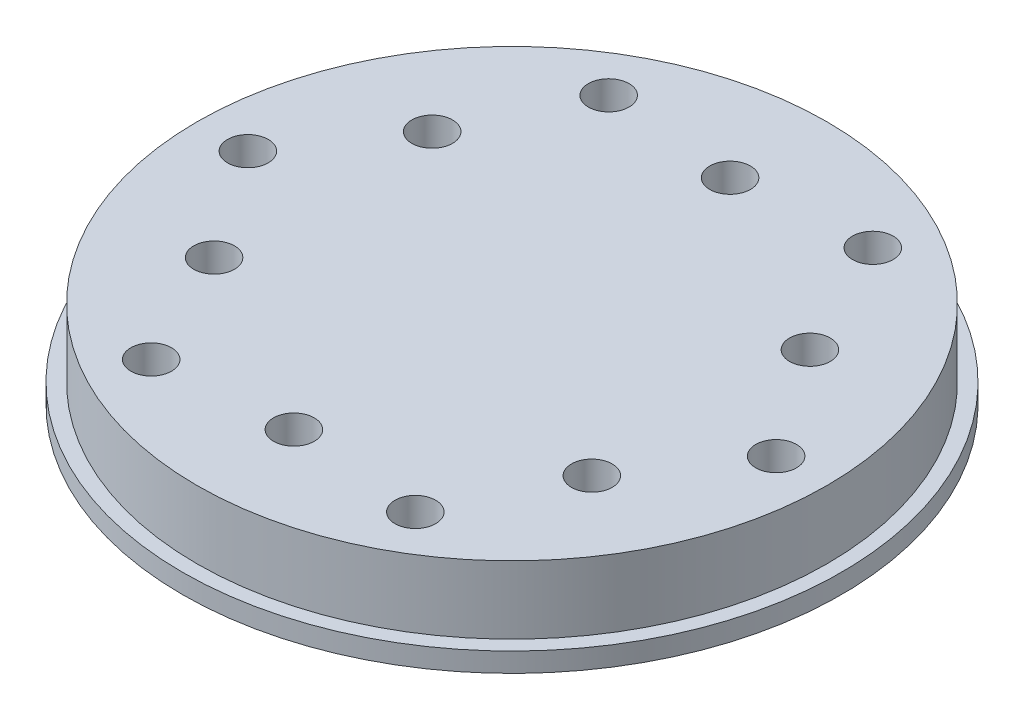
ISO-10303-21;
HEADER;
FILE_DESCRIPTION(('STEP AP214'),'2;1');
FILE_NAME('part.step','',(''),(''),'','','');
FILE_SCHEMA(('AUTOMOTIVE_DESIGN { 1 0 10303 214 1 1 1 1 }'));
ENDSEC;
DATA;
#1=APPLICATION_CONTEXT('core data for automotive mechanical design processes');
#2=APPLICATION_PROTOCOL_DEFINITION('international standard','automotive_design',2000,#1);
#3=PRODUCT_CONTEXT('',#1,'mechanical');
#4=PRODUCT('Part','Part','',(#3));
#5=PRODUCT_RELATED_PRODUCT_CATEGORY('part','',(#4));
#6=PRODUCT_DEFINITION_FORMATION('','',#4);
#7=PRODUCT_DEFINITION_CONTEXT('part definition',#1,'design');
#8=PRODUCT_DEFINITION('design','',#6,#7);
#9=PRODUCT_DEFINITION_SHAPE('','',#8);
#10=(LENGTH_UNIT() NAMED_UNIT(*) SI_UNIT(.MILLI.,.METRE.));
#11=(NAMED_UNIT(*) PLANE_ANGLE_UNIT() SI_UNIT($,.RADIAN.));
#12=(NAMED_UNIT(*) SI_UNIT($,.STERADIAN.) SOLID_ANGLE_UNIT());
#13=UNCERTAINTY_MEASURE_WITH_UNIT(LENGTH_MEASURE(1.E-05),#10,'distance_accuracy_value','');
#14=(GEOMETRIC_REPRESENTATION_CONTEXT(3) GLOBAL_UNCERTAINTY_ASSIGNED_CONTEXT((#13)) GLOBAL_UNIT_ASSIGNED_CONTEXT((#10,
#11,#12)) REPRESENTATION_CONTEXT('',''));
#15=CARTESIAN_POINT('',(0.,0.,0.));
#16=DIRECTION('',(0.,0.,1.));
#17=DIRECTION('',(1.,0.,0.));
#18=AXIS2_PLACEMENT_3D('',#15,#16,#17);
#19=CARTESIAN_POINT('',(0.,10.,0.));
#20=DIRECTION('',(0.,-1.,0.));
#21=DIRECTION('',(0.,0.,-1.));
#22=AXIS2_PLACEMENT_3D('',#19,#20,#21);
#23=CYLINDRICAL_SURFACE('',#22,32.5);
#24=CARTESIAN_POINT('',(0.,10.,0.));
#25=DIRECTION('',(0.,1.,0.));
#26=DIRECTION('',(0.,0.,1.));
#27=AXIS2_PLACEMENT_3D('',#24,#25,#26);
#28=CIRCLE('',#27,32.5);
#29=CARTESIAN_POINT('',(0.,10.,32.5));
#30=VERTEX_POINT('',#29);
#31=EDGE_CURVE('E64',#30,#30,#28,.T.);
#32=ORIENTED_EDGE('',*,*,#31,.F.);
#33=EDGE_LOOP('',(#32));
#34=FACE_BOUND('',#33,.T.);
#35=CARTESIAN_POINT('',(0.,2.99999999999996,0.));
#36=DIRECTION('',(0.,-1.,0.));
#37=DIRECTION('',(0.,0.,-1.));
#38=AXIS2_PLACEMENT_3D('',#35,#36,#37);
#39=CIRCLE('',#38,32.5);
#40=CARTESIAN_POINT('',(0.,2.99999999999991,-32.5));
#41=VERTEX_POINT('',#40);
#42=EDGE_CURVE('E12',#41,#41,#39,.T.);
#43=ORIENTED_EDGE('',*,*,#42,.F.);
#44=EDGE_LOOP('',(#43));
#45=FACE_BOUND('',#44,.T.);
#46=ADVANCED_FACE('F56',(#34,#45),#23,.T.);
#47=CARTESIAN_POINT('',(0.,0.,0.));
#48=DIRECTION('',(0.,1.,0.));
#49=DIRECTION('',(0.,0.,1.));
#50=AXIS2_PLACEMENT_3D('',#47,#48,#49);
#51=PLANE('',#50);
#52=CARTESIAN_POINT('',(0.,0.,0.));
#53=DIRECTION('',(0.,1.,0.));
#54=DIRECTION('',(0.,0.,1.));
#55=AXIS2_PLACEMENT_3D('',#52,#53,#54);
#56=CIRCLE('',#55,6.5);
#57=CARTESIAN_POINT('',(0.,0.,6.5));
#58=VERTEX_POINT('',#57);
#59=EDGE_CURVE('E72',#58,#58,#56,.T.);
#60=ORIENTED_EDGE('',*,*,#59,.T.);
#61=EDGE_LOOP('',(#60));
#62=FACE_BOUND('',#61,.T.);
#63=CARTESIAN_POINT('',(0.,0.,0.));
#64=DIRECTION('',(0.,-1.,0.));
#65=DIRECTION('',(0.,0.,-1.));
#66=AXIS2_PLACEMENT_3D('',#63,#64,#65);
#67=CIRCLE('',#66,17.5);
#68=CARTESIAN_POINT('',(0.,0.,-17.5));
#69=VERTEX_POINT('',#68);
#70=EDGE_CURVE('E130',#69,#69,#67,.T.);
#71=ORIENTED_EDGE('',*,*,#70,.T.);
#72=EDGE_LOOP('',(#71));
#73=FACE_BOUND('',#72,.T.);
#74=ADVANCED_FACE('F224',(#62,#73),#51,.F.);
#75=CARTESIAN_POINT('',(0.,10.,0.));
#76=DIRECTION('',(0.,-1.,0.));
#77=DIRECTION('',(0.,0.,-1.));
#78=AXIS2_PLACEMENT_3D('',#75,#76,#77);
#79=CYLINDRICAL_SURFACE('',#78,6.5);
#80=ORIENTED_EDGE('',*,*,#59,.F.);
#81=EDGE_LOOP('',(#80));
#82=FACE_BOUND('',#81,.T.);
#83=CARTESIAN_POINT('',(0.,3.5,0.));
#84=DIRECTION('',(0.,1.,0.));
#85=DIRECTION('',(0.,0.,1.));
#86=AXIS2_PLACEMENT_3D('',#83,#84,#85);
#87=CIRCLE('',#86,6.5);
#88=CARTESIAN_POINT('',(0.,3.5,6.5));
#89=VERTEX_POINT('',#88);
#90=EDGE_CURVE('E108',#89,#89,#87,.T.);
#91=ORIENTED_EDGE('',*,*,#90,.T.);
#92=EDGE_LOOP('',(#91));
#93=FACE_BOUND('',#92,.T.);
#94=ADVANCED_FACE('F228',(#82,#93),#79,.F.);
#95=CARTESIAN_POINT('',(0.,3.5,0.));
#96=DIRECTION('',(0.,1.,0.));
#97=DIRECTION('',(0.,0.,1.));
#98=AXIS2_PLACEMENT_3D('',#95,#96,#97);
#99=PLANE('',#98);
#100=ORIENTED_EDGE('',*,*,#90,.F.);
#101=EDGE_LOOP('',(#100));
#102=FACE_BOUND('',#101,.T.);
#103=ADVANCED_FACE('F233',(#102),#99,.F.);
#104=CARTESIAN_POINT('',(0.,1.,0.));
#105=DIRECTION('',(0.,-1.,0.));
#106=DIRECTION('',(0.,0.,-1.));
#107=AXIS2_PLACEMENT_3D('',#104,#105,#106);
#108=PLANE('',#107);
#109=CARTESIAN_POINT('',(0.,0.999999999999999,-22.5));
#110=DIRECTION('',(0.,-1.,0.));
#111=DIRECTION('',(0.,0.,-1.));
#112=AXIS2_PLACEMENT_3D('',#109,#110,#111);
#113=CIRCLE('',#112,2.1);
#114=CARTESIAN_POINT('',(0.,0.999999999999999,-24.6));
#115=VERTEX_POINT('',#114);
#116=EDGE_CURVE('E180',#115,#115,#113,.T.);
#117=ORIENTED_EDGE('',*,*,#116,.F.);
#118=EDGE_LOOP('',(#117));
#119=FACE_BOUND('',#118,.T.);
#120=CARTESIAN_POINT('',(19.4855715851499,0.999999999999999,-11.25));
#121=DIRECTION('',(0.,-1.,0.));
#122=DIRECTION('',(0.,0.,-1.));
#123=AXIS2_PLACEMENT_3D('',#120,#121,#122);
#124=CIRCLE('',#123,2.1);
#125=CARTESIAN_POINT('',(19.4855715851499,0.999999999999999,-13.35));
#126=VERTEX_POINT('',#125);
#127=EDGE_CURVE('E172',#126,#126,#124,.T.);
#128=ORIENTED_EDGE('',*,*,#127,.F.);
#129=EDGE_LOOP('',(#128));
#130=FACE_BOUND('',#129,.T.);
#131=CARTESIAN_POINT('',(19.4855715851499,0.999999999999999,11.25));
#132=DIRECTION('',(0.,-1.,0.));
#133=DIRECTION('',(0.,0.,-1.));
#134=AXIS2_PLACEMENT_3D('',#131,#132,#133);
#135=CIRCLE('',#134,2.1);
#136=CARTESIAN_POINT('',(19.4855715851499,0.999999999999999,9.15));
#137=VERTEX_POINT('',#136);
#138=EDGE_CURVE('E164',#137,#137,#135,.T.);
#139=ORIENTED_EDGE('',*,*,#138,.F.);
#140=EDGE_LOOP('',(#139));
#141=FACE_BOUND('',#140,.T.);
#142=CARTESIAN_POINT('',(0.,0.999999999999999,22.5));
#143=DIRECTION('',(0.,-1.,0.));
#144=DIRECTION('',(0.,0.,-1.));
#145=AXIS2_PLACEMENT_3D('',#142,#143,#144);
#146=CIRCLE('',#145,2.1);
#147=CARTESIAN_POINT('',(0.,0.999999999999999,20.4));
#148=VERTEX_POINT('',#147);
#149=EDGE_CURVE('E156',#148,#148,#146,.T.);
#150=ORIENTED_EDGE('',*,*,#149,.F.);
#151=EDGE_LOOP('',(#150));
#152=FACE_BOUND('',#151,.T.);
#153=CARTESIAN_POINT('',(-19.4855715851499,0.999999999999999,11.25));
#154=DIRECTION('',(0.,-1.,0.));
#155=DIRECTION('',(0.,0.,-1.));
#156=AXIS2_PLACEMENT_3D('',#153,#154,#155);
#157=CIRCLE('',#156,2.1);
#158=CARTESIAN_POINT('',(-19.4855715851499,0.999999999999999,9.15000000000001));
#159=VERTEX_POINT('',#158);
#160=EDGE_CURVE('E149',#159,#159,#157,.T.);
#161=ORIENTED_EDGE('',*,*,#160,.F.);
#162=EDGE_LOOP('',(#161));
#163=FACE_BOUND('',#162,.T.);
#164=CARTESIAN_POINT('',(-19.4855715851499,0.999999999999999,-11.25));
#165=DIRECTION('',(0.,-1.,0.));
#166=DIRECTION('',(0.,0.,-1.));
#167=AXIS2_PLACEMENT_3D('',#164,#165,#166);
#168=CIRCLE('',#167,2.1);
#169=CARTESIAN_POINT('',(-19.4855715851499,0.999999999999999,-13.35));
#170=VERTEX_POINT('',#169);
#171=EDGE_CURVE('E59',#170,#170,#168,.T.);
#172=ORIENTED_EDGE('',*,*,#171,.F.);
#173=EDGE_LOOP('',(#172));
#174=FACE_BOUND('',#173,.T.);
#175=CARTESIAN_POINT('',(0.,1.,0.));
#176=DIRECTION('',(0.,-1.,0.));
#177=DIRECTION('',(0.,0.,-1.));
#178=AXIS2_PLACEMENT_3D('',#175,#176,#177);
#179=CIRCLE('',#178,17.5);
#180=CARTESIAN_POINT('',(0.,1.,-17.5));
#181=VERTEX_POINT('',#180);
#182=EDGE_CURVE('E79',#181,#181,#179,.T.);
#183=ORIENTED_EDGE('',*,*,#182,.F.);
#184=EDGE_LOOP('',(#183));
#185=FACE_BOUND('',#184,.T.);
#186=CARTESIAN_POINT('',(-13.625,0.999999999999999,-23.5991922531259));
#187=DIRECTION('',(0.,-1.,0.));
#188=DIRECTION('',(0.,0.,-1.));
#189=AXIS2_PLACEMENT_3D('',#186,#187,#188);
#190=CIRCLE('',#189,2.1);
#191=CARTESIAN_POINT('',(-13.625,0.999999999999999,-25.6991922531259));
#192=VERTEX_POINT('',#191);
#193=EDGE_CURVE('E75',#192,#192,#190,.F.);
#194=ORIENTED_EDGE('',*,*,#193,.T.);
#195=EDGE_LOOP('',(#194));
#196=FACE_BOUND('',#195,.T.);
#197=CARTESIAN_POINT('',(13.625,0.999999999999999,-23.599192253126));
#198=DIRECTION('',(0.,-1.,0.));
#199=DIRECTION('',(0.,0.,-1.));
#200=AXIS2_PLACEMENT_3D('',#197,#198,#199);
#201=CIRCLE('',#200,2.1);
#202=CARTESIAN_POINT('',(13.625,0.999999999999999,-25.699192253126));
#203=VERTEX_POINT('',#202);
#204=EDGE_CURVE('E78',#203,#203,#201,.F.);
#205=ORIENTED_EDGE('',*,*,#204,.T.);
#206=EDGE_LOOP('',(#205));
#207=FACE_BOUND('',#206,.T.);
#208=CARTESIAN_POINT('',(27.25,0.999999999999999,0.));
#209=DIRECTION('',(0.,-1.,0.));
#210=DIRECTION('',(0.,0.,-1.));
#211=AXIS2_PLACEMENT_3D('',#208,#209,#210);
#212=CIRCLE('',#211,2.1);
#213=CARTESIAN_POINT('',(27.25,0.999999999999999,-2.10000000000001));
#214=VERTEX_POINT('',#213);
#215=EDGE_CURVE('E124',#214,#214,#212,.F.);
#216=ORIENTED_EDGE('',*,*,#215,.T.);
#217=EDGE_LOOP('',(#216));
#218=FACE_BOUND('',#217,.T.);
#219=CARTESIAN_POINT('',(13.625,0.999999999999999,23.599192253126));
#220=DIRECTION('',(0.,-1.,0.));
#221=DIRECTION('',(0.,0.,-1.));
#222=AXIS2_PLACEMENT_3D('',#219,#220,#221);
#223=CIRCLE('',#222,2.1);
#224=CARTESIAN_POINT('',(13.625,0.999999999999999,21.499192253126));
#225=VERTEX_POINT('',#224);
#226=EDGE_CURVE('E120',#225,#225,#223,.F.);
#227=ORIENTED_EDGE('',*,*,#226,.T.);
#228=EDGE_LOOP('',(#227));
#229=FACE_BOUND('',#228,.T.);
#230=CARTESIAN_POINT('',(-13.625,0.999999999999999,23.599192253126));
#231=DIRECTION('',(0.,-1.,0.));
#232=DIRECTION('',(0.,0.,-1.));
#233=AXIS2_PLACEMENT_3D('',#230,#231,#232);
#234=CIRCLE('',#233,2.1);
#235=CARTESIAN_POINT('',(-13.625,0.999999999999999,21.499192253126));
#236=VERTEX_POINT('',#235);
#237=EDGE_CURVE('E116',#236,#236,#234,.F.);
#238=ORIENTED_EDGE('',*,*,#237,.T.);
#239=EDGE_LOOP('',(#238));
#240=FACE_BOUND('',#239,.T.);
#241=CARTESIAN_POINT('',(-27.25,0.999999999999999,0.));
#242=DIRECTION('',(0.,-1.,0.));
#243=DIRECTION('',(0.,0.,-1.));
#244=AXIS2_PLACEMENT_3D('',#241,#242,#243);
#245=CIRCLE('',#244,2.1);
#246=CARTESIAN_POINT('',(-27.25,0.999999999999999,-2.09999999999995));
#247=VERTEX_POINT('',#246);
#248=EDGE_CURVE('E112',#247,#247,#245,.F.);
#249=ORIENTED_EDGE('',*,*,#248,.T.);
#250=EDGE_LOOP('',(#249));
#251=FACE_BOUND('',#250,.T.);
#252=CARTESIAN_POINT('',(0.,0.999999999999953,0.));
#253=DIRECTION('',(0.,-1.,0.));
#254=DIRECTION('',(0.,0.,-1.));
#255=AXIS2_PLACEMENT_3D('',#252,#253,#254);
#256=CIRCLE('',#255,34.);
#257=CARTESIAN_POINT('',(0.,0.999999999999907,-34.));
#258=VERTEX_POINT('',#257);
#259=EDGE_CURVE('E141',#258,#258,#256,.T.);
#260=ORIENTED_EDGE('',*,*,#259,.T.);
#261=EDGE_LOOP('',(#260));
#262=FACE_BOUND('',#261,.T.);
#263=ADVANCED_FACE('F264',(#119,#130,#141,#152,#163,#174,#185,#196,#207,#218,#229,#240,#251,
#262),#108,.T.);
#264=CARTESIAN_POINT('',(0.,1.,0.));
#265=DIRECTION('',(0.,-1.,0.));
#266=DIRECTION('',(0.,0.,-1.));
#267=AXIS2_PLACEMENT_3D('',#264,#265,#266);
#268=CYLINDRICAL_SURFACE('',#267,17.5);
#269=ORIENTED_EDGE('',*,*,#182,.T.);
#270=EDGE_LOOP('',(#269));
#271=FACE_BOUND('',#270,.T.);
#272=ORIENTED_EDGE('',*,*,#70,.F.);
#273=EDGE_LOOP('',(#272));
#274=FACE_BOUND('',#273,.T.);
#275=ADVANCED_FACE('F242',(#271,#274),#268,.T.);
#276=CARTESIAN_POINT('',(-27.25,10.,0.));
#277=DIRECTION('',(0.,1.,0.));
#278=DIRECTION('',(0.,0.,1.));
#279=AXIS2_PLACEMENT_3D('',#276,#277,#278);
#280=CYLINDRICAL_SURFACE('',#279,2.1);
#281=CARTESIAN_POINT('',(-27.25,10.,0.));
#282=DIRECTION('',(0.,1.,0.));
#283=DIRECTION('',(0.,0.,1.));
#284=AXIS2_PLACEMENT_3D('',#281,#282,#283);
#285=CIRCLE('',#284,2.1);
#286=CARTESIAN_POINT('',(-27.25,10.,2.10000000000004));
#287=VERTEX_POINT('',#286);
#288=EDGE_CURVE('E84',#287,#287,#285,.T.);
#289=ORIENTED_EDGE('',*,*,#288,.T.);
#290=EDGE_LOOP('',(#289));
#291=FACE_BOUND('',#290,.T.);
#292=ORIENTED_EDGE('',*,*,#248,.F.);
#293=EDGE_LOOP('',(#292));
#294=FACE_BOUND('',#293,.T.);
#295=ADVANCED_FACE('F238',(#291,#294),#280,.F.);
#296=CARTESIAN_POINT('',(-13.625,10.,23.599192253126));
#297=DIRECTION('',(0.,1.,0.));
#298=DIRECTION('',(0.,0.,1.));
#299=AXIS2_PLACEMENT_3D('',#296,#297,#298);
#300=CYLINDRICAL_SURFACE('',#299,2.1);
#301=CARTESIAN_POINT('',(-13.625,10.,23.599192253126));
#302=DIRECTION('',(0.,1.,0.));
#303=DIRECTION('',(0.,0.,1.));
#304=AXIS2_PLACEMENT_3D('',#301,#302,#303);
#305=CIRCLE('',#304,2.1);
#306=CARTESIAN_POINT('',(-13.625,10.,25.699192253126));
#307=VERTEX_POINT('',#306);
#308=EDGE_CURVE('E88',#307,#307,#305,.T.);
#309=ORIENTED_EDGE('',*,*,#308,.T.);
#310=EDGE_LOOP('',(#309));
#311=FACE_BOUND('',#310,.T.);
#312=ORIENTED_EDGE('',*,*,#237,.F.);
#313=EDGE_LOOP('',(#312));
#314=FACE_BOUND('',#313,.T.);
#315=ADVANCED_FACE('F241',(#311,#314),#300,.F.);
#316=CARTESIAN_POINT('',(13.625,10.,23.599192253126));
#317=DIRECTION('',(0.,1.,0.));
#318=DIRECTION('',(0.,0.,1.));
#319=AXIS2_PLACEMENT_3D('',#316,#317,#318);
#320=CYLINDRICAL_SURFACE('',#319,2.1);
#321=CARTESIAN_POINT('',(13.625,10.,23.599192253126));
#322=DIRECTION('',(0.,1.,0.));
#323=DIRECTION('',(0.,0.,1.));
#324=AXIS2_PLACEMENT_3D('',#321,#322,#323);
#325=CIRCLE('',#324,2.1);
#326=CARTESIAN_POINT('',(13.625,10.,25.699192253126));
#327=VERTEX_POINT('',#326);
#328=EDGE_CURVE('E92',#327,#327,#325,.T.);
#329=ORIENTED_EDGE('',*,*,#328,.T.);
#330=EDGE_LOOP('',(#329));
#331=FACE_BOUND('',#330,.T.);
#332=ORIENTED_EDGE('',*,*,#226,.F.);
#333=EDGE_LOOP('',(#332));
#334=FACE_BOUND('',#333,.T.);
#335=ADVANCED_FACE('F246',(#331,#334),#320,.F.);
#336=CARTESIAN_POINT('',(27.25,10.,0.));
#337=DIRECTION('',(0.,1.,0.));
#338=DIRECTION('',(0.,0.,1.));
#339=AXIS2_PLACEMENT_3D('',#336,#337,#338);
#340=CYLINDRICAL_SURFACE('',#339,2.1);
#341=CARTESIAN_POINT('',(27.25,10.,0.));
#342=DIRECTION('',(0.,1.,0.));
#343=DIRECTION('',(0.,0.,1.));
#344=AXIS2_PLACEMENT_3D('',#341,#342,#343);
#345=CIRCLE('',#344,2.1);
#346=CARTESIAN_POINT('',(27.25,10.,2.09999999999998));
#347=VERTEX_POINT('',#346);
#348=EDGE_CURVE('E96',#347,#347,#345,.T.);
#349=ORIENTED_EDGE('',*,*,#348,.T.);
#350=EDGE_LOOP('',(#349));
#351=FACE_BOUND('',#350,.T.);
#352=ORIENTED_EDGE('',*,*,#215,.F.);
#353=EDGE_LOOP('',(#352));
#354=FACE_BOUND('',#353,.T.);
#355=ADVANCED_FACE('F250',(#351,#354),#340,.F.);
#356=CARTESIAN_POINT('',(13.625,10.,-23.599192253126));
#357=DIRECTION('',(0.,1.,0.));
#358=DIRECTION('',(0.,0.,1.));
#359=AXIS2_PLACEMENT_3D('',#356,#357,#358);
#360=CYLINDRICAL_SURFACE('',#359,2.1);
#361=CARTESIAN_POINT('',(13.625,10.,-23.599192253126));
#362=DIRECTION('',(0.,1.,0.));
#363=DIRECTION('',(0.,0.,1.));
#364=AXIS2_PLACEMENT_3D('',#361,#362,#363);
#365=CIRCLE('',#364,2.1);
#366=CARTESIAN_POINT('',(13.625,10.,-21.499192253126));
#367=VERTEX_POINT('',#366);
#368=EDGE_CURVE('E100',#367,#367,#365,.T.);
#369=ORIENTED_EDGE('',*,*,#368,.T.);
#370=EDGE_LOOP('',(#369));
#371=FACE_BOUND('',#370,.T.);
#372=ORIENTED_EDGE('',*,*,#204,.F.);
#373=EDGE_LOOP('',(#372));
#374=FACE_BOUND('',#373,.T.);
#375=ADVANCED_FACE('F196',(#371,#374),#360,.F.);
#376=CARTESIAN_POINT('',(0.,10.,0.));
#377=DIRECTION('',(0.,1.,0.));
#378=DIRECTION('',(0.,0.,1.));
#379=AXIS2_PLACEMENT_3D('',#376,#377,#378);
#380=PLANE('',#379);
#381=CARTESIAN_POINT('',(0.,10.,-22.5));
#382=DIRECTION('',(0.,1.,0.));
#383=DIRECTION('',(0.,0.,1.));
#384=AXIS2_PLACEMENT_3D('',#381,#382,#383);
#385=CIRCLE('',#384,2.1);
#386=CARTESIAN_POINT('',(0.,10.,-20.4));
#387=VERTEX_POINT('',#386);
#388=EDGE_CURVE('E184',#387,#387,#385,.T.);
#389=ORIENTED_EDGE('',*,*,#388,.F.);
#390=EDGE_LOOP('',(#389));
#391=FACE_BOUND('',#390,.T.);
#392=CARTESIAN_POINT('',(19.4855715851499,10.,-11.25));
#393=DIRECTION('',(0.,1.,0.));
#394=DIRECTION('',(0.,0.,1.));
#395=AXIS2_PLACEMENT_3D('',#392,#393,#394);
#396=CIRCLE('',#395,2.1);
#397=CARTESIAN_POINT('',(19.4855715851499,10.,-9.15));
#398=VERTEX_POINT('',#397);
#399=EDGE_CURVE('E176',#398,#398,#396,.T.);
#400=ORIENTED_EDGE('',*,*,#399,.F.);
#401=EDGE_LOOP('',(#400));
#402=FACE_BOUND('',#401,.T.);
#403=CARTESIAN_POINT('',(19.4855715851499,10.,11.25));
#404=DIRECTION('',(0.,1.,0.));
#405=DIRECTION('',(0.,0.,1.));
#406=AXIS2_PLACEMENT_3D('',#403,#404,#405);
#407=CIRCLE('',#406,2.1);
#408=CARTESIAN_POINT('',(19.4855715851499,10.,13.35));
#409=VERTEX_POINT('',#408);
#410=EDGE_CURVE('E168',#409,#409,#407,.T.);
#411=ORIENTED_EDGE('',*,*,#410,.F.);
#412=EDGE_LOOP('',(#411));
#413=FACE_BOUND('',#412,.T.);
#414=CARTESIAN_POINT('',(0.,10.,22.5));
#415=DIRECTION('',(0.,1.,0.));
#416=DIRECTION('',(0.,0.,1.));
#417=AXIS2_PLACEMENT_3D('',#414,#415,#416);
#418=CIRCLE('',#417,2.1);
#419=CARTESIAN_POINT('',(0.,10.,24.6));
#420=VERTEX_POINT('',#419);
#421=EDGE_CURVE('E160',#420,#420,#418,.T.);
#422=ORIENTED_EDGE('',*,*,#421,.F.);
#423=EDGE_LOOP('',(#422));
#424=FACE_BOUND('',#423,.T.);
#425=CARTESIAN_POINT('',(-19.4855715851499,10.,11.25));
#426=DIRECTION('',(0.,1.,0.));
#427=DIRECTION('',(0.,0.,1.));
#428=AXIS2_PLACEMENT_3D('',#425,#426,#427);
#429=CIRCLE('',#428,2.1);
#430=CARTESIAN_POINT('',(-19.4855715851499,10.,13.35));
#431=VERTEX_POINT('',#430);
#432=EDGE_CURVE('E153',#431,#431,#429,.T.);
#433=ORIENTED_EDGE('',*,*,#432,.F.);
#434=EDGE_LOOP('',(#433));
#435=FACE_BOUND('',#434,.T.);
#436=CARTESIAN_POINT('',(-19.4855715851499,10.,-11.25));
#437=DIRECTION('',(0.,1.,0.));
#438=DIRECTION('',(0.,0.,1.));
#439=AXIS2_PLACEMENT_3D('',#436,#437,#438);
#440=CIRCLE('',#439,2.1);
#441=CARTESIAN_POINT('',(-19.4855715851499,10.,-9.15));
#442=VERTEX_POINT('',#441);
#443=EDGE_CURVE('E145',#442,#442,#440,.T.);
#444=ORIENTED_EDGE('',*,*,#443,.F.);
#445=EDGE_LOOP('',(#444));
#446=FACE_BOUND('',#445,.T.);
#447=CARTESIAN_POINT('',(-13.625,10.,-23.5991922531259));
#448=DIRECTION('',(0.,1.,0.));
#449=DIRECTION('',(0.,0.,1.));
#450=AXIS2_PLACEMENT_3D('',#447,#448,#449);
#451=CIRCLE('',#450,2.1);
#452=CARTESIAN_POINT('',(-13.625,10.,-21.4991922531259));
#453=VERTEX_POINT('',#452);
#454=EDGE_CURVE('E104',#453,#453,#451,.T.);
#455=ORIENTED_EDGE('',*,*,#454,.F.);
#456=EDGE_LOOP('',(#455));
#457=FACE_BOUND('',#456,.T.);
#458=ORIENTED_EDGE('',*,*,#368,.F.);
#459=EDGE_LOOP('',(#458));
#460=FACE_BOUND('',#459,.T.);
#461=ORIENTED_EDGE('',*,*,#348,.F.);
#462=EDGE_LOOP('',(#461));
#463=FACE_BOUND('',#462,.T.);
#464=ORIENTED_EDGE('',*,*,#328,.F.);
#465=EDGE_LOOP('',(#464));
#466=FACE_BOUND('',#465,.T.);
#467=ORIENTED_EDGE('',*,*,#308,.F.);
#468=EDGE_LOOP('',(#467));
#469=FACE_BOUND('',#468,.T.);
#470=ORIENTED_EDGE('',*,*,#288,.F.);
#471=EDGE_LOOP('',(#470));
#472=FACE_BOUND('',#471,.T.);
#473=ORIENTED_EDGE('',*,*,#31,.T.);
#474=EDGE_LOOP('',(#473));
#475=FACE_BOUND('',#474,.T.);
#476=ADVANCED_FACE('F192',(#391,#402,#413,#424,#435,#446,#457,#460,#463,#466,#469,#472,#475),
#380,.T.);
#477=CARTESIAN_POINT('',(-13.625,10.,-23.5991922531259));
#478=DIRECTION('',(0.,1.,0.));
#479=DIRECTION('',(0.,0.,1.));
#480=AXIS2_PLACEMENT_3D('',#477,#478,#479);
#481=CYLINDRICAL_SURFACE('',#480,2.1);
#482=ORIENTED_EDGE('',*,*,#454,.T.);
#483=EDGE_LOOP('',(#482));
#484=FACE_BOUND('',#483,.T.);
#485=ORIENTED_EDGE('',*,*,#193,.F.);
#486=EDGE_LOOP('',(#485));
#487=FACE_BOUND('',#486,.T.);
#488=ADVANCED_FACE('F195',(#484,#487),#481,.F.);
#489=CARTESIAN_POINT('',(0.,3.,32.5));
#490=DIRECTION('',(0.,-1.,0.));
#491=DIRECTION('',(0.,0.,-1.));
#492=AXIS2_PLACEMENT_3D('',#489,#490,#491);
#493=PLANE('',#492);
#494=CARTESIAN_POINT('',(0.,2.99999999999995,0.));
#495=DIRECTION('',(0.,-1.,0.));
#496=DIRECTION('',(0.,0.,-1.));
#497=AXIS2_PLACEMENT_3D('',#494,#495,#496);
#498=CIRCLE('',#497,34.);
#499=CARTESIAN_POINT('',(0.,2.99999999999991,-34.));
#500=VERTEX_POINT('',#499);
#501=EDGE_CURVE('E134',#500,#500,#498,.T.);
#502=ORIENTED_EDGE('',*,*,#501,.F.);
#503=EDGE_LOOP('',(#502));
#504=FACE_BOUND('',#503,.T.);
#505=ORIENTED_EDGE('',*,*,#42,.T.);
#506=EDGE_LOOP('',(#505));
#507=FACE_BOUND('',#506,.T.);
#508=ADVANCED_FACE('F260',(#504,#507),#493,.F.);
#509=CARTESIAN_POINT('',(0.,0.,0.));
#510=DIRECTION('',(0.,-1.,0.));
#511=DIRECTION('',(0.,0.,-1.));
#512=AXIS2_PLACEMENT_3D('',#509,#510,#511);
#513=CYLINDRICAL_SURFACE('',#512,34.);
#514=ORIENTED_EDGE('',*,*,#259,.F.);
#515=EDGE_LOOP('',(#514));
#516=FACE_BOUND('',#515,.T.);
#517=ORIENTED_EDGE('',*,*,#501,.T.);
#518=EDGE_LOOP('',(#517));
#519=FACE_BOUND('',#518,.T.);
#520=ADVANCED_FACE('F274',(#516,#519),#513,.T.);
#521=CARTESIAN_POINT('',(-19.4855715851499,10.,-11.25));
#522=DIRECTION('',(0.,1.,0.));
#523=DIRECTION('',(0.,0.,1.));
#524=AXIS2_PLACEMENT_3D('',#521,#522,#523);
#525=CYLINDRICAL_SURFACE('',#524,2.1);
#526=ORIENTED_EDGE('',*,*,#171,.T.);
#527=EDGE_LOOP('',(#526));
#528=FACE_BOUND('',#527,.T.);
#529=ORIENTED_EDGE('',*,*,#443,.T.);
#530=EDGE_LOOP('',(#529));
#531=FACE_BOUND('',#530,.T.);
#532=ADVANCED_FACE('F278',(#528,#531),#525,.F.);
#533=CARTESIAN_POINT('',(-19.4855715851499,10.,11.25));
#534=DIRECTION('',(0.,1.,0.));
#535=DIRECTION('',(0.,0.,1.));
#536=AXIS2_PLACEMENT_3D('',#533,#534,#535);
#537=CYLINDRICAL_SURFACE('',#536,2.1);
#538=ORIENTED_EDGE('',*,*,#160,.T.);
#539=EDGE_LOOP('',(#538));
#540=FACE_BOUND('',#539,.T.);
#541=ORIENTED_EDGE('',*,*,#432,.T.);
#542=EDGE_LOOP('',(#541));
#543=FACE_BOUND('',#542,.T.);
#544=ADVANCED_FACE('F282',(#540,#543),#537,.F.);
#545=CARTESIAN_POINT('',(0.,10.,22.5));
#546=DIRECTION('',(0.,1.,0.));
#547=DIRECTION('',(0.,0.,1.));
#548=AXIS2_PLACEMENT_3D('',#545,#546,#547);
#549=CYLINDRICAL_SURFACE('',#548,2.1);
#550=ORIENTED_EDGE('',*,*,#149,.T.);
#551=EDGE_LOOP('',(#550));
#552=FACE_BOUND('',#551,.T.);
#553=ORIENTED_EDGE('',*,*,#421,.T.);
#554=EDGE_LOOP('',(#553));
#555=FACE_BOUND('',#554,.T.);
#556=ADVANCED_FACE('F286',(#552,#555),#549,.F.);
#557=CARTESIAN_POINT('',(19.4855715851499,10.,11.25));
#558=DIRECTION('',(0.,1.,0.));
#559=DIRECTION('',(0.,0.,1.));
#560=AXIS2_PLACEMENT_3D('',#557,#558,#559);
#561=CYLINDRICAL_SURFACE('',#560,2.1);
#562=ORIENTED_EDGE('',*,*,#138,.T.);
#563=EDGE_LOOP('',(#562));
#564=FACE_BOUND('',#563,.T.);
#565=ORIENTED_EDGE('',*,*,#410,.T.);
#566=EDGE_LOOP('',(#565));
#567=FACE_BOUND('',#566,.T.);
#568=ADVANCED_FACE('F290',(#564,#567),#561,.F.);
#569=CARTESIAN_POINT('',(19.4855715851499,10.,-11.25));
#570=DIRECTION('',(0.,1.,0.));
#571=DIRECTION('',(0.,0.,1.));
#572=AXIS2_PLACEMENT_3D('',#569,#570,#571);
#573=CYLINDRICAL_SURFACE('',#572,2.1);
#574=ORIENTED_EDGE('',*,*,#127,.T.);
#575=EDGE_LOOP('',(#574));
#576=FACE_BOUND('',#575,.T.);
#577=ORIENTED_EDGE('',*,*,#399,.T.);
#578=EDGE_LOOP('',(#577));
#579=FACE_BOUND('',#578,.T.);
#580=ADVANCED_FACE('F294',(#576,#579),#573,.F.);
#581=CARTESIAN_POINT('',(0.,10.,-22.5));
#582=DIRECTION('',(0.,1.,0.));
#583=DIRECTION('',(0.,0.,1.));
#584=AXIS2_PLACEMENT_3D('',#581,#582,#583);
#585=CYLINDRICAL_SURFACE('',#584,2.1);
#586=ORIENTED_EDGE('',*,*,#116,.T.);
#587=EDGE_LOOP('',(#586));
#588=FACE_BOUND('',#587,.T.);
#589=ORIENTED_EDGE('',*,*,#388,.T.);
#590=EDGE_LOOP('',(#589));
#591=FACE_BOUND('',#590,.T.);
#592=ADVANCED_FACE('F190',(#588,#591),#585,.F.);
#593=CLOSED_SHELL('',(#46,#74,#94,#103,#263,#275,#295,#315,#335,#355,#375,#476,#488,#508,#520,
#532,#544,#556,#568,#580,#592));
#594=MANIFOLD_SOLID_BREP('B2',#593);
#595=ADVANCED_BREP_SHAPE_REPRESENTATION('',(#18,#594),#14);
#596=SHAPE_DEFINITION_REPRESENTATION(#9,#595);
ENDSEC;
END-ISO-10303-21;
